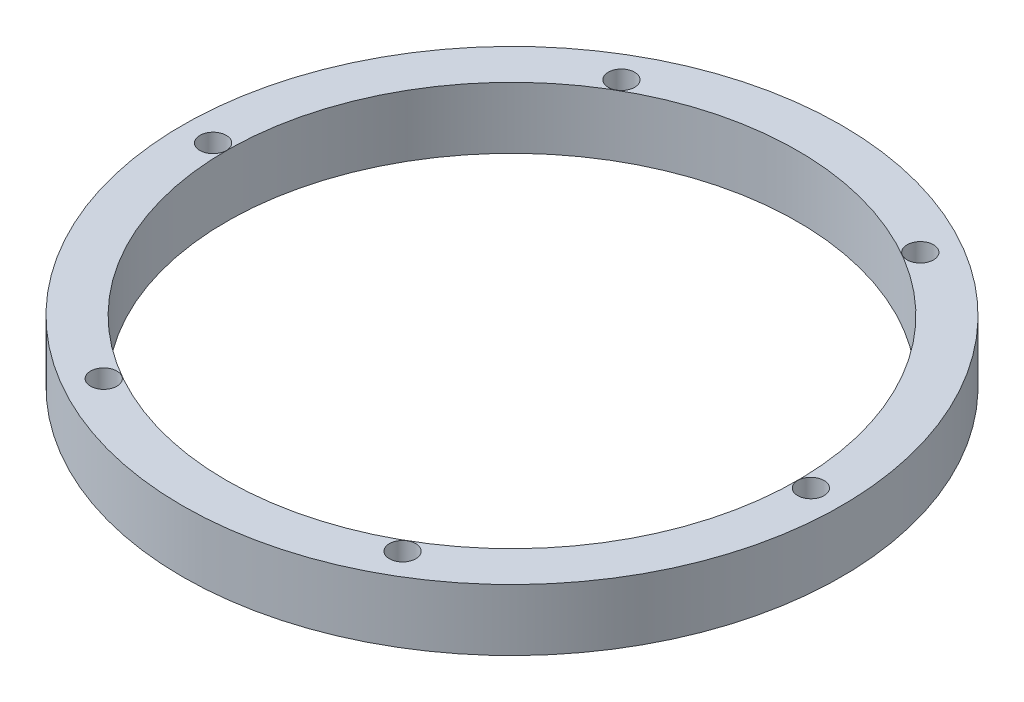
ISO-10303-21;
HEADER;
FILE_DESCRIPTION(('STEP AP214'),'2;1');
FILE_NAME('part.step','',(''),(''),'','','');
FILE_SCHEMA(('AUTOMOTIVE_DESIGN { 1 0 10303 214 1 1 1 1 }'));
ENDSEC;
DATA;
#1=APPLICATION_CONTEXT('core data for automotive mechanical design processes');
#2=APPLICATION_PROTOCOL_DEFINITION('international standard','automotive_design',2000,#1);
#3=PRODUCT_CONTEXT('',#1,'mechanical');
#4=PRODUCT('Part','Part','',(#3));
#5=PRODUCT_RELATED_PRODUCT_CATEGORY('part','',(#4));
#6=PRODUCT_DEFINITION_FORMATION('','',#4);
#7=PRODUCT_DEFINITION_CONTEXT('part definition',#1,'design');
#8=PRODUCT_DEFINITION('design','',#6,#7);
#9=PRODUCT_DEFINITION_SHAPE('','',#8);
#10=(LENGTH_UNIT() NAMED_UNIT(*) SI_UNIT(.MILLI.,.METRE.));
#11=(NAMED_UNIT(*) PLANE_ANGLE_UNIT() SI_UNIT($,.RADIAN.));
#12=(NAMED_UNIT(*) SI_UNIT($,.STERADIAN.) SOLID_ANGLE_UNIT());
#13=UNCERTAINTY_MEASURE_WITH_UNIT(LENGTH_MEASURE(1.E-05),#10,'distance_accuracy_value','');
#14=(GEOMETRIC_REPRESENTATION_CONTEXT(3) GLOBAL_UNCERTAINTY_ASSIGNED_CONTEXT((#13)) GLOBAL_UNIT_ASSIGNED_CONTEXT((#10,
#11,#12)) REPRESENTATION_CONTEXT('',''));
#15=CARTESIAN_POINT('',(0.,0.,0.));
#16=DIRECTION('',(0.,0.,1.));
#17=DIRECTION('',(1.,0.,0.));
#18=AXIS2_PLACEMENT_3D('',#15,#16,#17);
#19=CARTESIAN_POINT('',(0.,7.,0.));
#20=DIRECTION('',(0.,1.,0.));
#21=DIRECTION('',(0.,0.,1.));
#22=AXIS2_PLACEMENT_3D('',#19,#20,#21);
#23=PLANE('',#22);
#24=CARTESIAN_POINT('',(17.0050000000001,7.,-29.4535239827087));
#25=DIRECTION('',(0.,1.,0.));
#26=DIRECTION('',(0.,0.,1.));
#27=AXIS2_PLACEMENT_3D('',#24,#25,#26);
#28=CIRCLE('',#27,1.5);
#29=CARTESIAN_POINT('',(17.0050000000001,7.,-27.9535239827087));
#30=VERTEX_POINT('',#29);
#31=EDGE_CURVE('E71',#30,#30,#28,.T.);
#32=ORIENTED_EDGE('',*,*,#31,.F.);
#33=EDGE_LOOP('',(#32));
#34=FACE_BOUND('',#33,.T.);
#35=CARTESIAN_POINT('',(-34.01,7.,0.));
#36=DIRECTION('',(0.,1.,0.));
#37=DIRECTION('',(0.,0.,1.));
#38=AXIS2_PLACEMENT_3D('',#35,#36,#37);
#39=CIRCLE('',#38,1.5);
#40=CARTESIAN_POINT('',(-34.01,7.,1.5));
#41=VERTEX_POINT('',#40);
#42=EDGE_CURVE('E59',#41,#41,#39,.T.);
#43=ORIENTED_EDGE('',*,*,#42,.F.);
#44=EDGE_LOOP('',(#43));
#45=FACE_BOUND('',#44,.T.);
#46=CARTESIAN_POINT('',(17.0049999999999,7.,29.4535239827088));
#47=DIRECTION('',(0.,1.,0.));
#48=DIRECTION('',(0.,0.,1.));
#49=AXIS2_PLACEMENT_3D('',#46,#47,#48);
#50=CIRCLE('',#49,1.5);
#51=CARTESIAN_POINT('',(17.0049999999999,7.,30.9535239827088));
#52=VERTEX_POINT('',#51);
#53=EDGE_CURVE('E47',#52,#52,#50,.T.);
#54=ORIENTED_EDGE('',*,*,#53,.F.);
#55=EDGE_LOOP('',(#54));
#56=FACE_BOUND('',#55,.T.);
#57=CARTESIAN_POINT('',(0.,7.,0.));
#58=DIRECTION('',(0.,1.,0.));
#59=DIRECTION('',(0.,0.,1.));
#60=AXIS2_PLACEMENT_3D('',#57,#58,#59);
#61=CIRCLE('',#60,37.5);
#62=CARTESIAN_POINT('',(0.,7.,37.5));
#63=VERTEX_POINT('',#62);
#64=EDGE_CURVE('E10',#63,#63,#61,.T.);
#65=ORIENTED_EDGE('',*,*,#64,.T.);
#66=EDGE_LOOP('',(#65));
#67=FACE_BOUND('',#66,.T.);
#68=CARTESIAN_POINT('',(0.,7.,0.));
#69=DIRECTION('',(0.,1.,0.));
#70=DIRECTION('',(0.,0.,1.));
#71=AXIS2_PLACEMENT_3D('',#68,#69,#70);
#72=CIRCLE('',#71,32.5);
#73=CARTESIAN_POINT('',(0.,7.,32.5));
#74=VERTEX_POINT('',#73);
#75=EDGE_CURVE('E42',#74,#74,#72,.T.);
#76=ORIENTED_EDGE('',*,*,#75,.F.);
#77=EDGE_LOOP('',(#76));
#78=FACE_BOUND('',#77,.T.);
#79=CARTESIAN_POINT('',(-17.0050000000001,7.,29.4535239827087));
#80=DIRECTION('',(0.,1.,0.));
#81=DIRECTION('',(0.,0.,1.));
#82=AXIS2_PLACEMENT_3D('',#79,#80,#81);
#83=CIRCLE('',#82,1.5);
#84=CARTESIAN_POINT('',(-17.0050000000001,7.,30.9535239827087));
#85=VERTEX_POINT('',#84);
#86=EDGE_CURVE('E53',#85,#85,#83,.T.);
#87=ORIENTED_EDGE('',*,*,#86,.F.);
#88=EDGE_LOOP('',(#87));
#89=FACE_BOUND('',#88,.T.);
#90=CARTESIAN_POINT('',(-17.0049999999999,7.,-29.4535239827088));
#91=DIRECTION('',(0.,1.,0.));
#92=DIRECTION('',(0.,0.,1.));
#93=AXIS2_PLACEMENT_3D('',#90,#91,#92);
#94=CIRCLE('',#93,1.5);
#95=CARTESIAN_POINT('',(-17.0049999999999,7.,-27.9535239827088));
#96=VERTEX_POINT('',#95);
#97=EDGE_CURVE('E65',#96,#96,#94,.T.);
#98=ORIENTED_EDGE('',*,*,#97,.F.);
#99=EDGE_LOOP('',(#98));
#100=FACE_BOUND('',#99,.T.);
#101=CARTESIAN_POINT('',(34.01,7.,0.));
#102=DIRECTION('',(0.,1.,0.));
#103=DIRECTION('',(0.,0.,1.));
#104=AXIS2_PLACEMENT_3D('',#101,#102,#103);
#105=CIRCLE('',#104,1.5);
#106=CARTESIAN_POINT('',(34.01,7.,1.5));
#107=VERTEX_POINT('',#106);
#108=EDGE_CURVE('E77',#107,#107,#105,.T.);
#109=ORIENTED_EDGE('',*,*,#108,.F.);
#110=EDGE_LOOP('',(#109));
#111=FACE_BOUND('',#110,.T.);
#112=ADVANCED_FACE('F31',(#34,#45,#56,#67,#78,#89,#100,#111),#23,.T.);
#113=CARTESIAN_POINT('',(0.,0.,0.));
#114=DIRECTION('',(0.,1.,0.));
#115=DIRECTION('',(0.,0.,1.));
#116=AXIS2_PLACEMENT_3D('',#113,#114,#115);
#117=PLANE('',#116);
#118=CARTESIAN_POINT('',(0.,0.,0.));
#119=DIRECTION('',(0.,1.,0.));
#120=DIRECTION('',(0.,0.,1.));
#121=AXIS2_PLACEMENT_3D('',#118,#119,#120);
#122=CIRCLE('',#121,37.5);
#123=CARTESIAN_POINT('',(0.,0.,37.5));
#124=VERTEX_POINT('',#123);
#125=EDGE_CURVE('E35',#124,#124,#122,.T.);
#126=ORIENTED_EDGE('',*,*,#125,.F.);
#127=EDGE_LOOP('',(#126));
#128=FACE_BOUND('',#127,.T.);
#129=CARTESIAN_POINT('',(0.,0.,0.));
#130=DIRECTION('',(0.,1.,0.));
#131=DIRECTION('',(0.,0.,1.));
#132=AXIS2_PLACEMENT_3D('',#129,#130,#131);
#133=CIRCLE('',#132,32.5);
#134=CARTESIAN_POINT('',(0.,0.,32.5));
#135=VERTEX_POINT('',#134);
#136=EDGE_CURVE('E44',#135,#135,#133,.T.);
#137=ORIENTED_EDGE('',*,*,#136,.T.);
#138=EDGE_LOOP('',(#137));
#139=FACE_BOUND('',#138,.T.);
#140=CARTESIAN_POINT('',(17.0049999999999,0.,29.4535239827088));
#141=DIRECTION('',(0.,1.,0.));
#142=DIRECTION('',(0.,0.,1.));
#143=AXIS2_PLACEMENT_3D('',#140,#141,#142);
#144=CIRCLE('',#143,1.5);
#145=CARTESIAN_POINT('',(17.0049999999999,0.,30.9535239827088));
#146=VERTEX_POINT('',#145);
#147=EDGE_CURVE('E50',#146,#146,#144,.T.);
#148=ORIENTED_EDGE('',*,*,#147,.T.);
#149=EDGE_LOOP('',(#148));
#150=FACE_BOUND('',#149,.T.);
#151=CARTESIAN_POINT('',(-17.0050000000001,0.,29.4535239827087));
#152=DIRECTION('',(0.,1.,0.));
#153=DIRECTION('',(0.,0.,1.));
#154=AXIS2_PLACEMENT_3D('',#151,#152,#153);
#155=CIRCLE('',#154,1.5);
#156=CARTESIAN_POINT('',(-17.0050000000001,0.,30.9535239827087));
#157=VERTEX_POINT('',#156);
#158=EDGE_CURVE('E56',#157,#157,#155,.T.);
#159=ORIENTED_EDGE('',*,*,#158,.T.);
#160=EDGE_LOOP('',(#159));
#161=FACE_BOUND('',#160,.T.);
#162=CARTESIAN_POINT('',(-34.01,0.,0.));
#163=DIRECTION('',(0.,1.,0.));
#164=DIRECTION('',(0.,0.,1.));
#165=AXIS2_PLACEMENT_3D('',#162,#163,#164);
#166=CIRCLE('',#165,1.5);
#167=CARTESIAN_POINT('',(-34.01,0.,1.5));
#168=VERTEX_POINT('',#167);
#169=EDGE_CURVE('E62',#168,#168,#166,.T.);
#170=ORIENTED_EDGE('',*,*,#169,.T.);
#171=EDGE_LOOP('',(#170));
#172=FACE_BOUND('',#171,.T.);
#173=CARTESIAN_POINT('',(-17.0049999999999,0.,-29.4535239827088));
#174=DIRECTION('',(0.,1.,0.));
#175=DIRECTION('',(0.,0.,1.));
#176=AXIS2_PLACEMENT_3D('',#173,#174,#175);
#177=CIRCLE('',#176,1.5);
#178=CARTESIAN_POINT('',(-17.0049999999999,0.,-27.9535239827088));
#179=VERTEX_POINT('',#178);
#180=EDGE_CURVE('E68',#179,#179,#177,.T.);
#181=ORIENTED_EDGE('',*,*,#180,.T.);
#182=EDGE_LOOP('',(#181));
#183=FACE_BOUND('',#182,.T.);
#184=CARTESIAN_POINT('',(17.0050000000001,0.,-29.4535239827087));
#185=DIRECTION('',(0.,1.,0.));
#186=DIRECTION('',(0.,0.,1.));
#187=AXIS2_PLACEMENT_3D('',#184,#185,#186);
#188=CIRCLE('',#187,1.5);
#189=CARTESIAN_POINT('',(17.0050000000001,0.,-27.9535239827087));
#190=VERTEX_POINT('',#189);
#191=EDGE_CURVE('E74',#190,#190,#188,.T.);
#192=ORIENTED_EDGE('',*,*,#191,.T.);
#193=EDGE_LOOP('',(#192));
#194=FACE_BOUND('',#193,.T.);
#195=CARTESIAN_POINT('',(34.01,0.,0.));
#196=DIRECTION('',(0.,1.,0.));
#197=DIRECTION('',(0.,0.,1.));
#198=AXIS2_PLACEMENT_3D('',#195,#196,#197);
#199=CIRCLE('',#198,1.5);
#200=CARTESIAN_POINT('',(34.01,0.,1.5));
#201=VERTEX_POINT('',#200);
#202=EDGE_CURVE('E80',#201,#201,#199,.T.);
#203=ORIENTED_EDGE('',*,*,#202,.T.);
#204=EDGE_LOOP('',(#203));
#205=FACE_BOUND('',#204,.T.);
#206=ADVANCED_FACE('F90',(#128,#139,#150,#161,#172,#183,#194,#205),#117,.F.);
#207=CARTESIAN_POINT('',(0.,7.,0.));
#208=DIRECTION('',(0.,-1.,0.));
#209=DIRECTION('',(0.,0.,-1.));
#210=AXIS2_PLACEMENT_3D('',#207,#208,#209);
#211=CYLINDRICAL_SURFACE('',#210,37.5);
#212=ORIENTED_EDGE('',*,*,#64,.F.);
#213=EDGE_LOOP('',(#212));
#214=FACE_BOUND('',#213,.T.);
#215=ORIENTED_EDGE('',*,*,#125,.T.);
#216=EDGE_LOOP('',(#215));
#217=FACE_BOUND('',#216,.T.);
#218=ADVANCED_FACE('F33',(#214,#217),#211,.T.);
#219=CARTESIAN_POINT('',(0.,7.,0.));
#220=DIRECTION('',(0.,-1.,0.));
#221=DIRECTION('',(0.,0.,-1.));
#222=AXIS2_PLACEMENT_3D('',#219,#220,#221);
#223=CYLINDRICAL_SURFACE('',#222,32.5);
#224=ORIENTED_EDGE('',*,*,#75,.T.);
#225=EDGE_LOOP('',(#224));
#226=FACE_BOUND('',#225,.T.);
#227=ORIENTED_EDGE('',*,*,#136,.F.);
#228=EDGE_LOOP('',(#227));
#229=FACE_BOUND('',#228,.T.);
#230=ADVANCED_FACE('F100',(#226,#229),#223,.F.);
#231=CARTESIAN_POINT('',(17.0049999999999,7.,29.4535239827088));
#232=DIRECTION('',(0.,-1.,0.));
#233=DIRECTION('',(0.,0.,-1.));
#234=AXIS2_PLACEMENT_3D('',#231,#232,#233);
#235=CYLINDRICAL_SURFACE('',#234,1.5);
#236=ORIENTED_EDGE('',*,*,#53,.T.);
#237=EDGE_LOOP('',(#236));
#238=FACE_BOUND('',#237,.T.);
#239=ORIENTED_EDGE('',*,*,#147,.F.);
#240=EDGE_LOOP('',(#239));
#241=FACE_BOUND('',#240,.T.);
#242=ADVANCED_FACE('F103',(#238,#241),#235,.F.);
#243=CARTESIAN_POINT('',(-17.0050000000001,7.,29.4535239827087));
#244=DIRECTION('',(0.,-1.,0.));
#245=DIRECTION('',(0.,0.,-1.));
#246=AXIS2_PLACEMENT_3D('',#243,#244,#245);
#247=CYLINDRICAL_SURFACE('',#246,1.5);
#248=ORIENTED_EDGE('',*,*,#86,.T.);
#249=EDGE_LOOP('',(#248));
#250=FACE_BOUND('',#249,.T.);
#251=ORIENTED_EDGE('',*,*,#158,.F.);
#252=EDGE_LOOP('',(#251));
#253=FACE_BOUND('',#252,.T.);
#254=ADVANCED_FACE('F107',(#250,#253),#247,.F.);
#255=CARTESIAN_POINT('',(-34.01,7.,0.));
#256=DIRECTION('',(0.,-1.,0.));
#257=DIRECTION('',(0.,0.,-1.));
#258=AXIS2_PLACEMENT_3D('',#255,#256,#257);
#259=CYLINDRICAL_SURFACE('',#258,1.5);
#260=ORIENTED_EDGE('',*,*,#42,.T.);
#261=EDGE_LOOP('',(#260));
#262=FACE_BOUND('',#261,.T.);
#263=ORIENTED_EDGE('',*,*,#169,.F.);
#264=EDGE_LOOP('',(#263));
#265=FACE_BOUND('',#264,.T.);
#266=ADVANCED_FACE('F111',(#262,#265),#259,.F.);
#267=CARTESIAN_POINT('',(-17.0049999999999,7.,-29.4535239827088));
#268=DIRECTION('',(0.,-1.,0.));
#269=DIRECTION('',(0.,0.,-1.));
#270=AXIS2_PLACEMENT_3D('',#267,#268,#269);
#271=CYLINDRICAL_SURFACE('',#270,1.5);
#272=ORIENTED_EDGE('',*,*,#97,.T.);
#273=EDGE_LOOP('',(#272));
#274=FACE_BOUND('',#273,.T.);
#275=ORIENTED_EDGE('',*,*,#180,.F.);
#276=EDGE_LOOP('',(#275));
#277=FACE_BOUND('',#276,.T.);
#278=ADVANCED_FACE('F115',(#274,#277),#271,.F.);
#279=CARTESIAN_POINT('',(17.0050000000001,7.,-29.4535239827087));
#280=DIRECTION('',(0.,-1.,0.));
#281=DIRECTION('',(0.,0.,-1.));
#282=AXIS2_PLACEMENT_3D('',#279,#280,#281);
#283=CYLINDRICAL_SURFACE('',#282,1.5);
#284=ORIENTED_EDGE('',*,*,#31,.T.);
#285=EDGE_LOOP('',(#284));
#286=FACE_BOUND('',#285,.T.);
#287=ORIENTED_EDGE('',*,*,#191,.F.);
#288=EDGE_LOOP('',(#287));
#289=FACE_BOUND('',#288,.T.);
#290=ADVANCED_FACE('F119',(#286,#289),#283,.F.);
#291=CARTESIAN_POINT('',(34.01,7.,0.));
#292=DIRECTION('',(0.,-1.,0.));
#293=DIRECTION('',(0.,0.,-1.));
#294=AXIS2_PLACEMENT_3D('',#291,#292,#293);
#295=CYLINDRICAL_SURFACE('',#294,1.5);
#296=ORIENTED_EDGE('',*,*,#108,.T.);
#297=EDGE_LOOP('',(#296));
#298=FACE_BOUND('',#297,.T.);
#299=ORIENTED_EDGE('',*,*,#202,.F.);
#300=EDGE_LOOP('',(#299));
#301=FACE_BOUND('',#300,.T.);
#302=ADVANCED_FACE('F86',(#298,#301),#295,.F.);
#303=CLOSED_SHELL('',(#112,#206,#218,#230,#242,#254,#266,#278,#290,#302));
#304=MANIFOLD_SOLID_BREP('B2',#303);
#305=ADVANCED_BREP_SHAPE_REPRESENTATION('',(#18,#304),#14);
#306=SHAPE_DEFINITION_REPRESENTATION(#9,#305);
ENDSEC;
END-ISO-10303-21;
